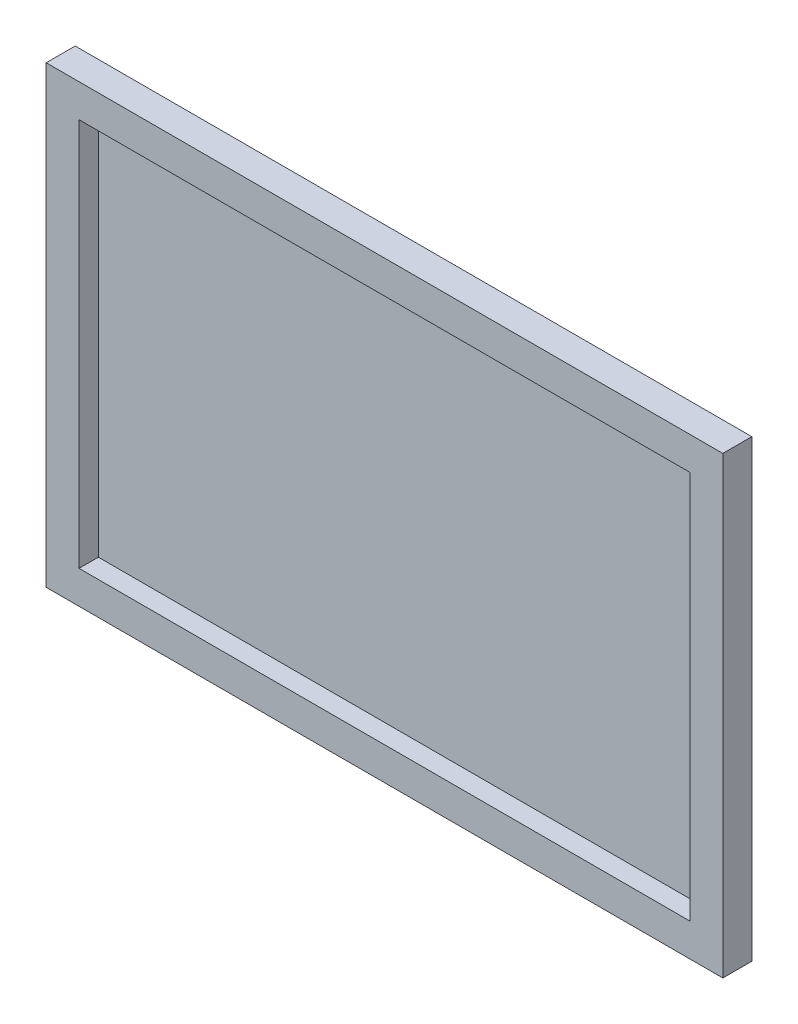
ISO-10303-21;
HEADER;
FILE_DESCRIPTION(('STEP AP214'),'2;1');
FILE_NAME('part.step','',(''),(''),'','','');
FILE_SCHEMA(('AUTOMOTIVE_DESIGN { 1 0 10303 214 1 1 1 1 }'));
ENDSEC;
DATA;
#1=APPLICATION_CONTEXT('core data for automotive mechanical design processes');
#2=APPLICATION_PROTOCOL_DEFINITION('international standard','automotive_design',2000,#1);
#3=PRODUCT_CONTEXT('',#1,'mechanical');
#4=PRODUCT('Part','Part','',(#3));
#5=PRODUCT_RELATED_PRODUCT_CATEGORY('part','',(#4));
#6=PRODUCT_DEFINITION_FORMATION('','',#4);
#7=PRODUCT_DEFINITION_CONTEXT('part definition',#1,'design');
#8=PRODUCT_DEFINITION('design','',#6,#7);
#9=PRODUCT_DEFINITION_SHAPE('','',#8);
#10=(LENGTH_UNIT() NAMED_UNIT(*) SI_UNIT(.MILLI.,.METRE.));
#11=(NAMED_UNIT(*) PLANE_ANGLE_UNIT() SI_UNIT($,.RADIAN.));
#12=(NAMED_UNIT(*) SI_UNIT($,.STERADIAN.) SOLID_ANGLE_UNIT());
#13=UNCERTAINTY_MEASURE_WITH_UNIT(LENGTH_MEASURE(1.E-05),#10,'distance_accuracy_value','');
#14=(GEOMETRIC_REPRESENTATION_CONTEXT(3) GLOBAL_UNCERTAINTY_ASSIGNED_CONTEXT((#13)) GLOBAL_UNIT_ASSIGNED_CONTEXT((#10,
#11,#12)) REPRESENTATION_CONTEXT('',''));
#15=CARTESIAN_POINT('',(0.,0.,0.));
#16=DIRECTION('',(0.,0.,1.));
#17=DIRECTION('',(1.,0.,0.));
#18=AXIS2_PLACEMENT_3D('',#15,#16,#17);
#19=CARTESIAN_POINT('',(175.,117.5,15.));
#20=DIRECTION('',(-1.,0.,0.));
#21=DIRECTION('',(0.,0.,1.));
#22=AXIS2_PLACEMENT_3D('',#19,#20,#21);
#23=PLANE('',#22);
#24=DIRECTION('',(0.,1.,0.));
#25=VECTOR('',#24,1.);
#26=CARTESIAN_POINT('',(175.,117.5,0.));
#27=LINE('',#26,#25);
#28=CARTESIAN_POINT('',(175.,-117.5,0.));
#29=VERTEX_POINT('',#28);
#30=CARTESIAN_POINT('',(175.,117.5,0.));
#31=VERTEX_POINT('',#30);
#32=EDGE_CURVE('E160',#29,#31,#27,.T.);
#33=ORIENTED_EDGE('',*,*,#32,.T.);
#34=DIRECTION('',(0.,0.,-1.));
#35=VECTOR('',#34,1.);
#36=CARTESIAN_POINT('',(175.,117.5,15.));
#37=LINE('',#36,#35);
#38=CARTESIAN_POINT('',(175.,117.5,15.));
#39=VERTEX_POINT('',#38);
#40=EDGE_CURVE('E11',#39,#31,#37,.T.);
#41=ORIENTED_EDGE('',*,*,#40,.F.);
#42=DIRECTION('',(0.,1.,0.));
#43=VECTOR('',#42,1.);
#44=CARTESIAN_POINT('',(175.,117.5,15.));
#45=LINE('',#44,#43);
#46=CARTESIAN_POINT('',(175.,-117.5,15.));
#47=VERTEX_POINT('',#46);
#48=EDGE_CURVE('E166',#47,#39,#45,.T.);
#49=ORIENTED_EDGE('',*,*,#48,.F.);
#50=DIRECTION('',(0.,0.,-1.));
#51=VECTOR('',#50,1.);
#52=CARTESIAN_POINT('',(175.,-117.5,15.));
#53=LINE('',#52,#51);
#54=EDGE_CURVE('E176',#47,#29,#53,.T.);
#55=ORIENTED_EDGE('',*,*,#54,.T.);
#56=EDGE_LOOP('',(#33,#41,#49,#55));
#57=FACE_BOUND('',#56,.T.);
#58=ADVANCED_FACE('F41',(#57),#23,.F.);
#59=CARTESIAN_POINT('',(-175.,117.5,15.));
#60=DIRECTION('',(0.,-1.,0.));
#61=DIRECTION('',(0.,0.,-1.));
#62=AXIS2_PLACEMENT_3D('',#59,#60,#61);
#63=PLANE('',#62);
#64=DIRECTION('',(-1.,0.,0.));
#65=VECTOR('',#64,1.);
#66=CARTESIAN_POINT('',(-175.,117.5,0.));
#67=LINE('',#66,#65);
#68=CARTESIAN_POINT('',(-175.,117.5,0.));
#69=VERTEX_POINT('',#68);
#70=EDGE_CURVE('E180',#31,#69,#67,.T.);
#71=ORIENTED_EDGE('',*,*,#70,.T.);
#72=DIRECTION('',(0.,0.,-1.));
#73=VECTOR('',#72,1.);
#74=CARTESIAN_POINT('',(-175.,117.5,15.));
#75=LINE('',#74,#73);
#76=CARTESIAN_POINT('',(-175.,117.5,15.));
#77=VERTEX_POINT('',#76);
#78=EDGE_CURVE('E49',#77,#69,#75,.T.);
#79=ORIENTED_EDGE('',*,*,#78,.F.);
#80=DIRECTION('',(-1.,0.,0.));
#81=VECTOR('',#80,1.);
#82=CARTESIAN_POINT('',(-175.,117.5,15.));
#83=LINE('',#82,#81);
#84=EDGE_CURVE('E93',#39,#77,#83,.T.);
#85=ORIENTED_EDGE('',*,*,#84,.F.);
#86=ORIENTED_EDGE('',*,*,#40,.T.);
#87=EDGE_LOOP('',(#71,#79,#85,#86));
#88=FACE_BOUND('',#87,.T.);
#89=ADVANCED_FACE('F215',(#88),#63,.F.);
#90=CARTESIAN_POINT('',(-175.,117.5,15.));
#91=DIRECTION('',(1.,0.,0.));
#92=DIRECTION('',(0.,0.,-1.));
#93=AXIS2_PLACEMENT_3D('',#90,#91,#92);
#94=PLANE('',#93);
#95=DIRECTION('',(0.,-1.,0.));
#96=VECTOR('',#95,1.);
#97=CARTESIAN_POINT('',(-175.,117.5,0.));
#98=LINE('',#97,#96);
#99=CARTESIAN_POINT('',(-175.,-117.5,0.));
#100=VERTEX_POINT('',#99);
#101=EDGE_CURVE('E183',#69,#100,#98,.T.);
#102=ORIENTED_EDGE('',*,*,#101,.T.);
#103=DIRECTION('',(0.,0.,-1.));
#104=VECTOR('',#103,1.);
#105=CARTESIAN_POINT('',(-175.,-117.5,15.));
#106=LINE('',#105,#104);
#107=CARTESIAN_POINT('',(-175.,-117.5,15.));
#108=VERTEX_POINT('',#107);
#109=EDGE_CURVE('E190',#108,#100,#106,.T.);
#110=ORIENTED_EDGE('',*,*,#109,.F.);
#111=DIRECTION('',(0.,-1.,0.));
#112=VECTOR('',#111,1.);
#113=CARTESIAN_POINT('',(-175.,117.5,15.));
#114=LINE('',#113,#112);
#115=EDGE_CURVE('E171',#77,#108,#114,.T.);
#116=ORIENTED_EDGE('',*,*,#115,.F.);
#117=ORIENTED_EDGE('',*,*,#78,.T.);
#118=EDGE_LOOP('',(#102,#110,#116,#117));
#119=FACE_BOUND('',#118,.T.);
#120=ADVANCED_FACE('F197',(#119),#94,.F.);
#121=CARTESIAN_POINT('',(-175.,-117.5,15.));
#122=DIRECTION('',(0.,1.,0.));
#123=DIRECTION('',(0.,0.,1.));
#124=AXIS2_PLACEMENT_3D('',#121,#122,#123);
#125=PLANE('',#124);
#126=DIRECTION('',(1.,0.,0.));
#127=VECTOR('',#126,1.);
#128=CARTESIAN_POINT('',(-175.,-117.5,0.));
#129=LINE('',#128,#127);
#130=EDGE_CURVE('E86',#100,#29,#129,.T.);
#131=ORIENTED_EDGE('',*,*,#130,.T.);
#132=ORIENTED_EDGE('',*,*,#54,.F.);
#133=DIRECTION('',(1.,0.,0.));
#134=VECTOR('',#133,1.);
#135=CARTESIAN_POINT('',(-175.,-117.5,15.));
#136=LINE('',#135,#134);
#137=EDGE_CURVE('E65',#108,#47,#136,.T.);
#138=ORIENTED_EDGE('',*,*,#137,.F.);
#139=ORIENTED_EDGE('',*,*,#109,.T.);
#140=EDGE_LOOP('',(#131,#132,#138,#139));
#141=FACE_BOUND('',#140,.T.);
#142=ADVANCED_FACE('F205',(#141),#125,.F.);
#143=CARTESIAN_POINT('',(0.,0.,15.));
#144=DIRECTION('',(0.,0.,1.));
#145=DIRECTION('',(1.,0.,0.));
#146=AXIS2_PLACEMENT_3D('',#143,#144,#145);
#147=PLANE('',#146);
#148=DIRECTION('',(0.,1.,0.));
#149=VECTOR('',#148,1.);
#150=CARTESIAN_POINT('',(158.,100.5,15.));
#151=LINE('',#150,#149);
#152=CARTESIAN_POINT('',(158.,-100.5,15.));
#153=VERTEX_POINT('',#152);
#154=CARTESIAN_POINT('',(158.,100.5,15.));
#155=VERTEX_POINT('',#154);
#156=EDGE_CURVE('E56',#153,#155,#151,.T.);
#157=ORIENTED_EDGE('',*,*,#156,.F.);
#158=DIRECTION('',(1.,0.,0.));
#159=VECTOR('',#158,1.);
#160=CARTESIAN_POINT('',(-158.,-100.5,15.));
#161=LINE('',#160,#159);
#162=CARTESIAN_POINT('',(-158.,-100.5,15.));
#163=VERTEX_POINT('',#162);
#164=EDGE_CURVE('E138',#163,#153,#161,.T.);
#165=ORIENTED_EDGE('',*,*,#164,.F.);
#166=DIRECTION('',(0.,-1.,0.));
#167=VECTOR('',#166,1.);
#168=CARTESIAN_POINT('',(-158.,100.5,15.));
#169=LINE('',#168,#167);
#170=CARTESIAN_POINT('',(-158.,100.5,15.));
#171=VERTEX_POINT('',#170);
#172=EDGE_CURVE('E142',#171,#163,#169,.T.);
#173=ORIENTED_EDGE('',*,*,#172,.F.);
#174=DIRECTION('',(-1.,0.,0.));
#175=VECTOR('',#174,1.);
#176=CARTESIAN_POINT('',(-158.,100.5,15.));
#177=LINE('',#176,#175);
#178=EDGE_CURVE('E151',#155,#171,#177,.T.);
#179=ORIENTED_EDGE('',*,*,#178,.F.);
#180=EDGE_LOOP('',(#157,#165,#173,#179));
#181=FACE_BOUND('',#180,.T.);
#182=ORIENTED_EDGE('',*,*,#48,.T.);
#183=ORIENTED_EDGE('',*,*,#84,.T.);
#184=ORIENTED_EDGE('',*,*,#115,.T.);
#185=ORIENTED_EDGE('',*,*,#137,.T.);
#186=EDGE_LOOP('',(#182,#183,#184,#185));
#187=FACE_BOUND('',#186,.T.);
#188=ADVANCED_FACE('F207',(#181,#187),#147,.T.);
#189=CARTESIAN_POINT('',(0.,0.,0.));
#190=DIRECTION('',(0.,0.,1.));
#191=DIRECTION('',(1.,0.,0.));
#192=AXIS2_PLACEMENT_3D('',#189,#190,#191);
#193=PLANE('',#192);
#194=ORIENTED_EDGE('',*,*,#32,.F.);
#195=ORIENTED_EDGE('',*,*,#130,.F.);
#196=ORIENTED_EDGE('',*,*,#101,.F.);
#197=ORIENTED_EDGE('',*,*,#70,.F.);
#198=EDGE_LOOP('',(#194,#195,#196,#197));
#199=FACE_BOUND('',#198,.T.);
#200=ADVANCED_FACE('F201',(#199),#193,.F.);
#201=CARTESIAN_POINT('',(158.,100.5,5.));
#202=DIRECTION('',(1.,0.,0.));
#203=DIRECTION('',(0.,0.,-1.));
#204=AXIS2_PLACEMENT_3D('',#201,#202,#203);
#205=PLANE('',#204);
#206=ORIENTED_EDGE('',*,*,#156,.T.);
#207=DIRECTION('',(0.,0.,1.));
#208=VECTOR('',#207,1.);
#209=CARTESIAN_POINT('',(158.,100.5,5.));
#210=LINE('',#209,#208);
#211=CARTESIAN_POINT('',(158.,100.5,5.));
#212=VERTEX_POINT('',#211);
#213=EDGE_CURVE('E113',#212,#155,#210,.T.);
#214=ORIENTED_EDGE('',*,*,#213,.F.);
#215=DIRECTION('',(0.,1.,0.));
#216=VECTOR('',#215,1.);
#217=CARTESIAN_POINT('',(158.,100.5,5.));
#218=LINE('',#217,#216);
#219=CARTESIAN_POINT('',(158.,-100.5,5.));
#220=VERTEX_POINT('',#219);
#221=EDGE_CURVE('E117',#220,#212,#218,.T.);
#222=ORIENTED_EDGE('',*,*,#221,.F.);
#223=DIRECTION('',(0.,0.,1.));
#224=VECTOR('',#223,1.);
#225=CARTESIAN_POINT('',(158.,-100.5,5.));
#226=LINE('',#225,#224);
#227=EDGE_CURVE('E157',#220,#153,#226,.T.);
#228=ORIENTED_EDGE('',*,*,#227,.T.);
#229=EDGE_LOOP('',(#206,#214,#222,#228));
#230=FACE_BOUND('',#229,.T.);
#231=ADVANCED_FACE('F115',(#230),#205,.F.);
#232=CARTESIAN_POINT('',(-158.,-100.5,5.));
#233=DIRECTION('',(0.,-1.,0.));
#234=DIRECTION('',(0.,0.,-1.));
#235=AXIS2_PLACEMENT_3D('',#232,#233,#234);
#236=PLANE('',#235);
#237=ORIENTED_EDGE('',*,*,#164,.T.);
#238=ORIENTED_EDGE('',*,*,#227,.F.);
#239=DIRECTION('',(1.,0.,0.));
#240=VECTOR('',#239,1.);
#241=CARTESIAN_POINT('',(-158.,-100.5,5.));
#242=LINE('',#241,#240);
#243=CARTESIAN_POINT('',(-158.,-100.5,5.));
#244=VERTEX_POINT('',#243);
#245=EDGE_CURVE('E124',#244,#220,#242,.T.);
#246=ORIENTED_EDGE('',*,*,#245,.F.);
#247=DIRECTION('',(0.,0.,1.));
#248=VECTOR('',#247,1.);
#249=CARTESIAN_POINT('',(-158.,-100.5,5.));
#250=LINE('',#249,#248);
#251=EDGE_CURVE('E161',#244,#163,#250,.T.);
#252=ORIENTED_EDGE('',*,*,#251,.T.);
#253=EDGE_LOOP('',(#237,#238,#246,#252));
#254=FACE_BOUND('',#253,.T.);
#255=ADVANCED_FACE('F255',(#254),#236,.F.);
#256=CARTESIAN_POINT('',(-158.,100.5,5.));
#257=DIRECTION('',(-1.,0.,0.));
#258=DIRECTION('',(0.,0.,1.));
#259=AXIS2_PLACEMENT_3D('',#256,#257,#258);
#260=PLANE('',#259);
#261=ORIENTED_EDGE('',*,*,#172,.T.);
#262=ORIENTED_EDGE('',*,*,#251,.F.);
#263=DIRECTION('',(0.,-1.,0.));
#264=VECTOR('',#263,1.);
#265=CARTESIAN_POINT('',(-158.,100.5,5.));
#266=LINE('',#265,#264);
#267=CARTESIAN_POINT('',(-158.,100.5,5.));
#268=VERTEX_POINT('',#267);
#269=EDGE_CURVE('E133',#268,#244,#266,.T.);
#270=ORIENTED_EDGE('',*,*,#269,.F.);
#271=DIRECTION('',(0.,0.,1.));
#272=VECTOR('',#271,1.);
#273=CARTESIAN_POINT('',(-158.,100.5,5.));
#274=LINE('',#273,#272);
#275=EDGE_CURVE('E123',#268,#171,#274,.T.);
#276=ORIENTED_EDGE('',*,*,#275,.T.);
#277=EDGE_LOOP('',(#261,#262,#270,#276));
#278=FACE_BOUND('',#277,.T.);
#279=ADVANCED_FACE('F264',(#278),#260,.F.);
#280=CARTESIAN_POINT('',(-158.,100.5,5.));
#281=DIRECTION('',(0.,1.,0.));
#282=DIRECTION('',(0.,0.,1.));
#283=AXIS2_PLACEMENT_3D('',#280,#281,#282);
#284=PLANE('',#283);
#285=ORIENTED_EDGE('',*,*,#178,.T.);
#286=ORIENTED_EDGE('',*,*,#275,.F.);
#287=DIRECTION('',(-1.,0.,0.));
#288=VECTOR('',#287,1.);
#289=CARTESIAN_POINT('',(-158.,100.5,5.));
#290=LINE('',#289,#288);
#291=EDGE_CURVE('E127',#212,#268,#290,.T.);
#292=ORIENTED_EDGE('',*,*,#291,.F.);
#293=ORIENTED_EDGE('',*,*,#213,.T.);
#294=EDGE_LOOP('',(#285,#286,#292,#293));
#295=FACE_BOUND('',#294,.T.);
#296=ADVANCED_FACE('F128',(#295),#284,.F.);
#297=CARTESIAN_POINT('',(0.,0.,5.));
#298=DIRECTION('',(0.,0.,1.));
#299=DIRECTION('',(1.,0.,0.));
#300=AXIS2_PLACEMENT_3D('',#297,#298,#299);
#301=PLANE('',#300);
#302=ORIENTED_EDGE('',*,*,#221,.T.);
#303=ORIENTED_EDGE('',*,*,#291,.T.);
#304=ORIENTED_EDGE('',*,*,#269,.T.);
#305=ORIENTED_EDGE('',*,*,#245,.T.);
#306=EDGE_LOOP('',(#302,#303,#304,#305));
#307=FACE_BOUND('',#306,.T.);
#308=ADVANCED_FACE('F135',(#307),#301,.T.);
#309=CLOSED_SHELL('',(#58,#89,#120,#142,#188,#200,#231,#255,#279,#296,#308));
#310=MANIFOLD_SOLID_BREP('B2',#309);
#311=ADVANCED_BREP_SHAPE_REPRESENTATION('',(#18,#310),#14);
#312=SHAPE_DEFINITION_REPRESENTATION(#9,#311);
ENDSEC;
END-ISO-10303-21;
